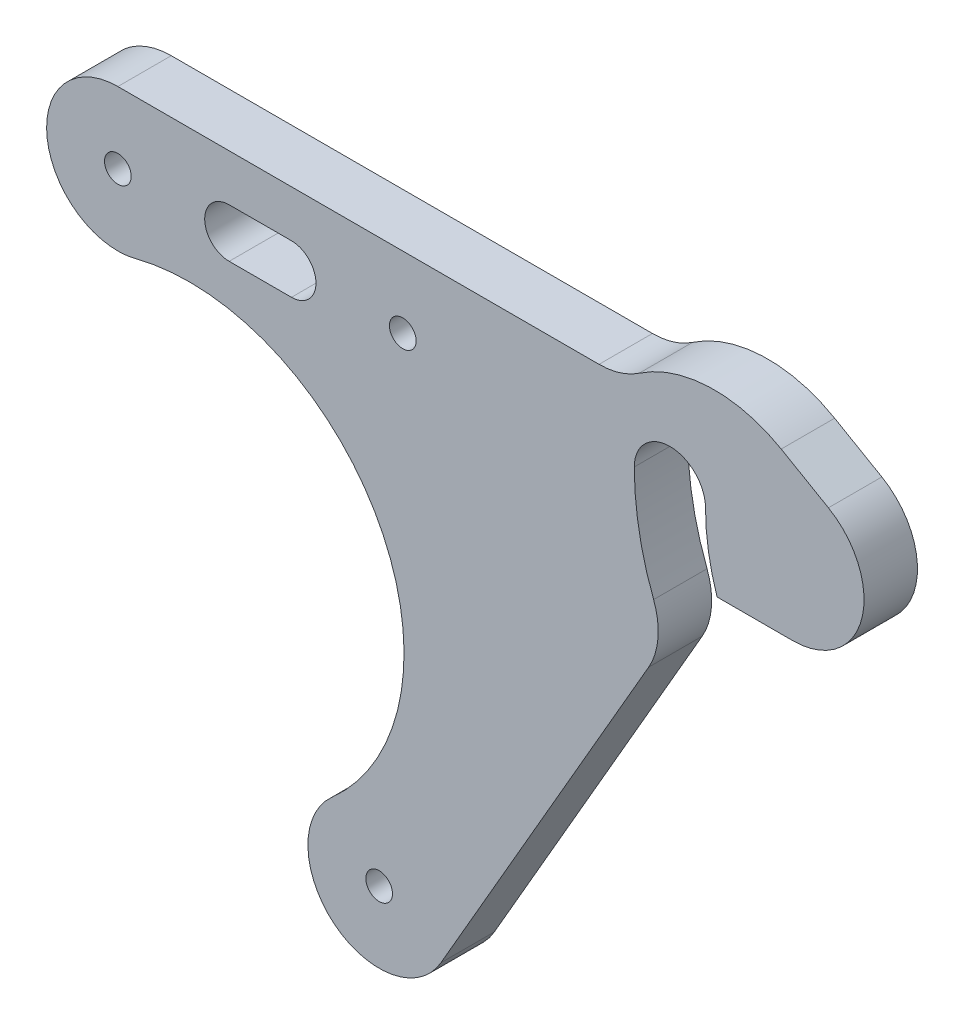
ISO-10303-21;
HEADER;
FILE_DESCRIPTION(('STEP AP214'),'2;1');
FILE_NAME('part.step','',(''),(''),'','','');
FILE_SCHEMA(('AUTOMOTIVE_DESIGN { 1 0 10303 214 1 1 1 1 }'));
ENDSEC;
DATA;
#1=APPLICATION_CONTEXT('core data for automotive mechanical design processes');
#2=APPLICATION_PROTOCOL_DEFINITION('international standard','automotive_design',2000,#1);
#3=PRODUCT_CONTEXT('',#1,'mechanical');
#4=PRODUCT('Part','Part','',(#3));
#5=PRODUCT_RELATED_PRODUCT_CATEGORY('part','',(#4));
#6=PRODUCT_DEFINITION_FORMATION('','',#4);
#7=PRODUCT_DEFINITION_CONTEXT('part definition',#1,'design');
#8=PRODUCT_DEFINITION('design','',#6,#7);
#9=PRODUCT_DEFINITION_SHAPE('','',#8);
#10=(LENGTH_UNIT() NAMED_UNIT(*) SI_UNIT(.MILLI.,.METRE.));
#11=(NAMED_UNIT(*) PLANE_ANGLE_UNIT() SI_UNIT($,.RADIAN.));
#12=(NAMED_UNIT(*) SI_UNIT($,.STERADIAN.) SOLID_ANGLE_UNIT());
#13=UNCERTAINTY_MEASURE_WITH_UNIT(LENGTH_MEASURE(1.E-05),#10,'distance_accuracy_value','');
#14=(GEOMETRIC_REPRESENTATION_CONTEXT(3) GLOBAL_UNCERTAINTY_ASSIGNED_CONTEXT((#13)) GLOBAL_UNIT_ASSIGNED_CONTEXT((#10,
#11,#12)) REPRESENTATION_CONTEXT('',''));
#15=CARTESIAN_POINT('',(0.,0.,0.));
#16=DIRECTION('',(0.,0.,1.));
#17=DIRECTION('',(1.,0.,0.));
#18=AXIS2_PLACEMENT_3D('',#15,#16,#17);
#19=CARTESIAN_POINT('',(7.45121519131535,12.9060426214425,6.));
#20=DIRECTION('',(-0.499995370404268,-0.866028076666282,0.));
#21=DIRECTION('',(0.866028076666282,-0.499995370404268,0.));
#22=AXIS2_PLACEMENT_3D('',#19,#20,#21);
#23=PLANE('',#22);
#24=DIRECTION('',(-0.866028076666282,0.499995370404268,0.));
#25=VECTOR('',#24,1.);
#26=CARTESIAN_POINT('',(7.45121519131535,12.9060426214425,0.));
#27=LINE('',#26,#25);
#28=CARTESIAN_POINT('',(17.8052275255482,6.9282246133319,0.));
#29=VERTEX_POINT('',#28);
#30=CARTESIAN_POINT('',(12.5012357528368,9.99044788584587,0.));
#31=VERTEX_POINT('',#30);
#32=EDGE_CURVE('E220',#29,#31,#27,.T.);
#33=ORIENTED_EDGE('',*,*,#32,.T.);
#34=DIRECTION('',(0.,0.,-1.));
#35=VECTOR('',#34,1.);
#36=CARTESIAN_POINT('',(12.5012357528368,9.99044788584587,6.));
#37=LINE('',#36,#35);
#38=CARTESIAN_POINT('',(12.5012357528368,9.99044788584587,6.));
#39=VERTEX_POINT('',#38);
#40=EDGE_CURVE('E11',#39,#31,#37,.T.);
#41=ORIENTED_EDGE('',*,*,#40,.F.);
#42=DIRECTION('',(-0.866028076666282,0.499995370404268,0.));
#43=VECTOR('',#42,1.);
#44=CARTESIAN_POINT('',(7.45121519131535,12.9060426214425,6.));
#45=LINE('',#44,#43);
#46=CARTESIAN_POINT('',(17.8052275255482,6.9282246133319,6.));
#47=VERTEX_POINT('',#46);
#48=EDGE_CURVE('E314',#47,#39,#45,.T.);
#49=ORIENTED_EDGE('',*,*,#48,.F.);
#50=DIRECTION('',(0.,0.,-1.));
#51=VECTOR('',#50,1.);
#52=CARTESIAN_POINT('',(17.8052275255482,6.9282246133319,6.));
#53=LINE('',#52,#51);
#54=EDGE_CURVE('E252',#47,#29,#53,.T.);
#55=ORIENTED_EDGE('',*,*,#54,.T.);
#56=EDGE_LOOP('',(#33,#41,#49,#55));
#57=FACE_BOUND('',#56,.T.);
#58=ADVANCED_FACE('F37',(#57),#23,.F.);
#59=CARTESIAN_POINT('',(5.00130519677297,-2.99997326414827,6.));
#60=DIRECTION('',(0.,0.,-1.));
#61=DIRECTION('',(-1.,0.,0.));
#62=AXIS2_PLACEMENT_3D('',#59,#60,#61);
#63=CYLINDRICAL_SURFACE('',#62,14.9999999999999);
#64=CARTESIAN_POINT('',(5.00130519677297,-2.99997326414827,0.));
#65=DIRECTION('',(0.,0.,1.));
#66=DIRECTION('',(1.,0.,0.));
#67=AXIS2_PLACEMENT_3D('',#64,#65,#66);
#68=CIRCLE('',#67,14.9999999999999);
#69=CARTESIAN_POINT('',(-3.45186040430899,9.39131364725386,0.));
#70=VERTEX_POINT('',#69);
#71=EDGE_CURVE('E223',#31,#70,#68,.T.);
#72=ORIENTED_EDGE('',*,*,#71,.T.);
#73=DIRECTION('',(0.,0.,-1.));
#74=VECTOR('',#73,1.);
#75=CARTESIAN_POINT('',(-3.45186040430899,9.39131364725386,6.));
#76=LINE('',#75,#74);
#77=CARTESIAN_POINT('',(-3.45186040430899,9.39131364725386,6.));
#78=VERTEX_POINT('',#77);
#79=EDGE_CURVE('E47',#78,#70,#76,.T.);
#80=ORIENTED_EDGE('',*,*,#79,.F.);
#81=CARTESIAN_POINT('',(5.00130519677297,-2.99997326414827,6.));
#82=DIRECTION('',(0.,0.,1.));
#83=DIRECTION('',(1.,0.,0.));
#84=AXIS2_PLACEMENT_3D('',#81,#82,#83);
#85=CIRCLE('',#84,14.9999999999999);
#86=EDGE_CURVE('E316',#39,#78,#85,.T.);
#87=ORIENTED_EDGE('',*,*,#86,.F.);
#88=ORIENTED_EDGE('',*,*,#40,.T.);
#89=EDGE_LOOP('',(#72,#80,#87,#88));
#90=FACE_BOUND('',#89,.T.);
#91=ADVANCED_FACE('F359',(#90),#63,.T.);
#92=CARTESIAN_POINT('',(-7.96021539155269,16.0000000000016,6.));
#93=DIRECTION('',(0.,0.,-1.));
#94=DIRECTION('',(-1.,0.,0.));
#95=AXIS2_PLACEMENT_3D('',#92,#93,#94);
#96=CYLINDRICAL_SURFACE('',#95,8.);
#97=CARTESIAN_POINT('',(-7.96021539155269,16.0000000000016,0.));
#98=DIRECTION('',(0.,0.,1.));
#99=DIRECTION('',(1.,0.,0.));
#100=AXIS2_PLACEMENT_3D('',#97,#98,#99);
#101=CIRCLE('',#100,8.);
#102=CARTESIAN_POINT('',(-7.96021539155269,8.00000000000164,0.));
#103=VERTEX_POINT('',#102);
#104=EDGE_CURVE('E225',#70,#103,#101,.F.);
#105=ORIENTED_EDGE('',*,*,#104,.T.);
#106=DIRECTION('',(0.,0.,-1.));
#107=VECTOR('',#106,1.);
#108=CARTESIAN_POINT('',(-7.96021539155269,8.00000000000164,6.));
#109=LINE('',#108,#107);
#110=CARTESIAN_POINT('',(-7.96021539155269,8.00000000000164,6.));
#111=VERTEX_POINT('',#110);
#112=EDGE_CURVE('E272',#111,#103,#109,.T.);
#113=ORIENTED_EDGE('',*,*,#112,.F.);
#114=CARTESIAN_POINT('',(-7.96021539155269,16.0000000000016,6.));
#115=DIRECTION('',(0.,0.,1.));
#116=DIRECTION('',(1.,0.,0.));
#117=AXIS2_PLACEMENT_3D('',#114,#115,#116);
#118=CIRCLE('',#117,8.);
#119=EDGE_CURVE('E318',#78,#111,#118,.F.);
#120=ORIENTED_EDGE('',*,*,#119,.F.);
#121=ORIENTED_EDGE('',*,*,#79,.T.);
#122=EDGE_LOOP('',(#105,#113,#120,#121));
#123=FACE_BOUND('',#122,.T.);
#124=ADVANCED_FACE('F364',(#123),#96,.F.);
#125=CARTESIAN_POINT('',(0.,8.00000000000164,6.));
#126=DIRECTION('',(0.,-1.,0.));
#127=DIRECTION('',(1.,0.,0.));
#128=AXIS2_PLACEMENT_3D('',#125,#126,#127);
#129=PLANE('',#128);
#130=DIRECTION('',(-1.,0.,0.));
#131=VECTOR('',#130,1.);
#132=CARTESIAN_POINT('',(0.,8.00000000000164,0.));
#133=LINE('',#132,#131);
#134=CARTESIAN_POINT('',(-62.,8.00000000000164,0.));
#135=VERTEX_POINT('',#134);
#136=EDGE_CURVE('E227',#103,#135,#133,.T.);
#137=ORIENTED_EDGE('',*,*,#136,.T.);
#138=DIRECTION('',(0.,0.,-1.));
#139=VECTOR('',#138,1.);
#140=CARTESIAN_POINT('',(-62.,8.00000000000164,6.));
#141=LINE('',#140,#139);
#142=CARTESIAN_POINT('',(-62.,8.00000000000164,6.));
#143=VERTEX_POINT('',#142);
#144=EDGE_CURVE('E269',#143,#135,#141,.T.);
#145=ORIENTED_EDGE('',*,*,#144,.F.);
#146=DIRECTION('',(-1.,0.,0.));
#147=VECTOR('',#146,1.);
#148=CARTESIAN_POINT('',(0.,8.00000000000164,6.));
#149=LINE('',#148,#147);
#150=EDGE_CURVE('E320',#111,#143,#149,.T.);
#151=ORIENTED_EDGE('',*,*,#150,.F.);
#152=ORIENTED_EDGE('',*,*,#112,.T.);
#153=EDGE_LOOP('',(#137,#145,#151,#152));
#154=FACE_BOUND('',#153,.T.);
#155=ADVANCED_FACE('F418',(#154),#129,.F.);
#156=CARTESIAN_POINT('',(-62.,1.62964755900087E-12,6.));
#157=DIRECTION('',(0.,0.,-1.));
#158=DIRECTION('',(-1.,0.,0.));
#159=AXIS2_PLACEMENT_3D('',#156,#157,#158);
#160=CYLINDRICAL_SURFACE('',#159,8.00000000000001);
#161=CARTESIAN_POINT('',(-62.,1.62964755900087E-12,0.));
#162=DIRECTION('',(0.,0.,1.));
#163=DIRECTION('',(1.,0.,0.));
#164=AXIS2_PLACEMENT_3D('',#161,#162,#163);
#165=CIRCLE('',#164,8.00000000000001);
#166=CARTESIAN_POINT('',(-59.997026703284,-7.74519838174709,0.));
#167=VERTEX_POINT('',#166);
#168=EDGE_CURVE('E229',#135,#167,#165,.T.);
#169=ORIENTED_EDGE('',*,*,#168,.T.);
#170=DIRECTION('',(0.,0.,-1.));
#171=VECTOR('',#170,1.);
#172=CARTESIAN_POINT('',(-59.997026703284,-7.74519838174709,6.));
#173=LINE('',#172,#171);
#174=CARTESIAN_POINT('',(-59.997026703284,-7.74519838174709,6.));
#175=VERTEX_POINT('',#174);
#176=EDGE_CURVE('E267',#175,#167,#173,.T.);
#177=ORIENTED_EDGE('',*,*,#176,.F.);
#178=CARTESIAN_POINT('',(-62.,1.62964755900087E-12,6.));
#179=DIRECTION('',(0.,0.,1.));
#180=DIRECTION('',(1.,0.,0.));
#181=AXIS2_PLACEMENT_3D('',#178,#179,#180);
#182=CIRCLE('',#181,8.00000000000001);
#183=EDGE_CURVE('E322',#143,#175,#182,.T.);
#184=ORIENTED_EDGE('',*,*,#183,.F.);
#185=ORIENTED_EDGE('',*,*,#144,.T.);
#186=EDGE_LOOP('',(#169,#177,#184,#185));
#187=FACE_BOUND('',#186,.T.);
#188=ADVANCED_FACE('F414',(#187),#160,.T.);
#189=CARTESIAN_POINT('',(-53.9618845314189,-31.0821911713126,6.));
#190=DIRECTION('',(0.,0.,-1.));
#191=DIRECTION('',(-1.,0.,0.));
#192=AXIS2_PLACEMENT_3D('',#189,#190,#191);
#193=CYLINDRICAL_SURFACE('',#192,24.1047334250943);
#194=CARTESIAN_POINT('',(-53.9618845314189,-31.0821911713126,0.));
#195=DIRECTION('',(0.,0.,1.));
#196=DIRECTION('',(1.,0.,0.));
#197=AXIS2_PLACEMENT_3D('',#194,#195,#196);
#198=CIRCLE('',#197,24.1047334250943);
#199=CARTESIAN_POINT('',(-38.0114462118029,-49.1548691938683,0.));
#200=VERTEX_POINT('',#199);
#201=EDGE_CURVE('E232',#200,#167,#198,.T.);
#202=ORIENTED_EDGE('',*,*,#201,.F.);
#203=DIRECTION('',(0.,0.,-1.));
#204=VECTOR('',#203,1.);
#205=CARTESIAN_POINT('',(-38.0114462118029,-49.1548691938683,6.));
#206=LINE('',#205,#204);
#207=CARTESIAN_POINT('',(-38.0114462118029,-49.1548691938683,6.));
#208=VERTEX_POINT('',#207);
#209=EDGE_CURVE('E265',#208,#200,#206,.T.);
#210=ORIENTED_EDGE('',*,*,#209,.F.);
#211=CARTESIAN_POINT('',(-53.9618845314189,-31.0821911713126,6.));
#212=DIRECTION('',(0.,0.,1.));
#213=DIRECTION('',(1.,0.,0.));
#214=AXIS2_PLACEMENT_3D('',#211,#212,#213);
#215=CIRCLE('',#214,24.1047334250943);
#216=EDGE_CURVE('E324',#208,#175,#215,.T.);
#217=ORIENTED_EDGE('',*,*,#216,.T.);
#218=ORIENTED_EDGE('',*,*,#176,.T.);
#219=EDGE_LOOP('',(#202,#210,#217,#218));
#220=FACE_BOUND('',#219,.T.);
#221=ADVANCED_FACE('F410',(#220),#193,.F.);
#222=CARTESIAN_POINT('',(-32.6527251776309,-55.0949120285555,6.));
#223=DIRECTION('',(0.,0.,-1.));
#224=DIRECTION('',(-1.,0.,0.));
#225=AXIS2_PLACEMENT_3D('',#222,#223,#224);
#226=CYLINDRICAL_SURFACE('',#225,7.9999999999998);
#227=CARTESIAN_POINT('',(-32.6527251776309,-55.0949120285555,0.));
#228=DIRECTION('',(0.,0.,1.));
#229=DIRECTION('',(1.,0.,0.));
#230=AXIS2_PLACEMENT_3D('',#227,#228,#229);
#231=CIRCLE('',#230,7.9999999999998);
#232=CARTESIAN_POINT('',(-25.7245219473544,-59.0949120285561,0.));
#233=VERTEX_POINT('',#232);
#234=EDGE_CURVE('E235',#233,#200,#231,.F.);
#235=ORIENTED_EDGE('',*,*,#234,.F.);
#236=DIRECTION('',(0.,0.,-1.));
#237=VECTOR('',#236,1.);
#238=CARTESIAN_POINT('',(-25.7245219473544,-59.0949120285561,6.));
#239=LINE('',#238,#237);
#240=CARTESIAN_POINT('',(-25.7245219473544,-59.0949120285561,6.));
#241=VERTEX_POINT('',#240);
#242=EDGE_CURVE('E263',#241,#233,#239,.T.);
#243=ORIENTED_EDGE('',*,*,#242,.F.);
#244=CARTESIAN_POINT('',(-32.6527251776309,-55.0949120285555,6.));
#245=DIRECTION('',(0.,0.,1.));
#246=DIRECTION('',(1.,0.,0.));
#247=AXIS2_PLACEMENT_3D('',#244,#245,#246);
#248=CIRCLE('',#247,7.9999999999998);
#249=EDGE_CURVE('E327',#241,#208,#248,.F.);
#250=ORIENTED_EDGE('',*,*,#249,.T.);
#251=ORIENTED_EDGE('',*,*,#209,.T.);
#252=EDGE_LOOP('',(#235,#243,#250,#251));
#253=FACE_BOUND('',#252,.T.);
#254=ADVANCED_FACE('F406',(#253),#226,.T.);
#255=CARTESIAN_POINT('',(6.29545606505251,-3.63468325382956,6.));
#256=DIRECTION('',(-0.866025403784436,0.500000000000004,0.));
#257=DIRECTION('',(-0.500000000000004,-0.866025403784436,0.));
#258=AXIS2_PLACEMENT_3D('',#255,#256,#257);
#259=PLANE('',#258);
#260=DIRECTION('',(0.500000000000004,0.866025403784436,0.));
#261=VECTOR('',#260,1.);
#262=CARTESIAN_POINT('',(6.29545606505251,-3.63468325382956,0.));
#263=LINE('',#262,#261);
#264=CARTESIAN_POINT('',(-2.37907845150454,-18.6594177685161,0.));
#265=VERTEX_POINT('',#264);
#266=EDGE_CURVE('E238',#233,#265,#263,.T.);
#267=ORIENTED_EDGE('',*,*,#266,.T.);
#268=DIRECTION('',(0.,0.,-1.));
#269=VECTOR('',#268,1.);
#270=CARTESIAN_POINT('',(-2.37907845150454,-18.6594177685161,6.));
#271=LINE('',#270,#269);
#272=CARTESIAN_POINT('',(-2.37907845150454,-18.6594177685161,6.));
#273=VERTEX_POINT('',#272);
#274=EDGE_CURVE('E260',#273,#265,#271,.T.);
#275=ORIENTED_EDGE('',*,*,#274,.F.);
#276=DIRECTION('',(0.500000000000004,0.866025403784436,0.));
#277=VECTOR('',#276,1.);
#278=CARTESIAN_POINT('',(6.29545606505251,-3.63468325382956,6.));
#279=LINE('',#278,#277);
#280=EDGE_CURVE('E330',#241,#273,#279,.T.);
#281=ORIENTED_EDGE('',*,*,#280,.F.);
#282=ORIENTED_EDGE('',*,*,#242,.T.);
#283=EDGE_LOOP('',(#267,#275,#281,#282));
#284=FACE_BOUND('',#283,.T.);
#285=ADVANCED_FACE('F402',(#284),#259,.F.);
#286=CARTESIAN_POINT('',(-9.30728168178016,-14.6594177685167,6.));
#287=DIRECTION('',(0.,0.,-1.));
#288=DIRECTION('',(-1.,0.,0.));
#289=AXIS2_PLACEMENT_3D('',#286,#287,#288);
#290=CYLINDRICAL_SURFACE('',#289,8.00000000000017);
#291=CARTESIAN_POINT('',(-9.30728168178016,-14.6594177685167,0.));
#292=DIRECTION('',(0.,0.,1.));
#293=DIRECTION('',(1.,0.,0.));
#294=AXIS2_PLACEMENT_3D('',#291,#292,#293);
#295=CIRCLE('',#294,8.00000000000017);
#296=CARTESIAN_POINT('',(-1.82950584046509,-11.8163791709853,0.));
#297=VERTEX_POINT('',#296);
#298=EDGE_CURVE('E240',#265,#297,#295,.T.);
#299=ORIENTED_EDGE('',*,*,#298,.T.);
#300=DIRECTION('',(0.,0.,-1.));
#301=VECTOR('',#300,1.);
#302=CARTESIAN_POINT('',(-1.82950584046509,-11.8163791709853,6.));
#303=LINE('',#302,#301);
#304=CARTESIAN_POINT('',(-1.82950584046509,-11.8163791709853,6.));
#305=VERTEX_POINT('',#304);
#306=EDGE_CURVE('E258',#305,#297,#303,.T.);
#307=ORIENTED_EDGE('',*,*,#306,.F.);
#308=CARTESIAN_POINT('',(-9.30728168178016,-14.6594177685167,6.));
#309=DIRECTION('',(0.,0.,1.));
#310=DIRECTION('',(1.,0.,0.));
#311=AXIS2_PLACEMENT_3D('',#308,#309,#310);
#312=CIRCLE('',#311,8.00000000000017);
#313=EDGE_CURVE('E332',#273,#305,#312,.T.);
#314=ORIENTED_EDGE('',*,*,#313,.F.);
#315=ORIENTED_EDGE('',*,*,#274,.T.);
#316=EDGE_LOOP('',(#299,#307,#314,#315));
#317=FACE_BOUND('',#316,.T.);
#318=ADVANCED_FACE('F398',(#317),#290,.T.);
#319=CARTESIAN_POINT('',(29.25,0.,6.));
#320=DIRECTION('',(0.,0.,-1.));
#321=DIRECTION('',(-1.,0.,0.));
#322=AXIS2_PLACEMENT_3D('',#319,#320,#321);
#323=CYLINDRICAL_SURFACE('',#322,33.25);
#324=CARTESIAN_POINT('',(29.25,0.,0.));
#325=DIRECTION('',(0.,0.,1.));
#326=DIRECTION('',(1.,0.,0.));
#327=AXIS2_PLACEMENT_3D('',#324,#325,#326);
#328=CIRCLE('',#327,33.25);
#329=CARTESIAN_POINT('',(-4.,0.,0.));
#330=VERTEX_POINT('',#329);
#331=EDGE_CURVE('E243',#330,#297,#328,.T.);
#332=ORIENTED_EDGE('',*,*,#331,.F.);
#333=DIRECTION('',(0.,0.,-1.));
#334=VECTOR('',#333,1.);
#335=CARTESIAN_POINT('',(-4.,0.,6.));
#336=LINE('',#335,#334);
#337=CARTESIAN_POINT('',(-4.,0.,6.));
#338=VERTEX_POINT('',#337);
#339=EDGE_CURVE('E256',#338,#330,#336,.T.);
#340=ORIENTED_EDGE('',*,*,#339,.F.);
#341=CARTESIAN_POINT('',(29.25,0.,6.));
#342=DIRECTION('',(0.,0.,1.));
#343=DIRECTION('',(1.,0.,0.));
#344=AXIS2_PLACEMENT_3D('',#341,#342,#343);
#345=CIRCLE('',#344,33.25);
#346=EDGE_CURVE('E334',#338,#305,#345,.T.);
#347=ORIENTED_EDGE('',*,*,#346,.T.);
#348=ORIENTED_EDGE('',*,*,#306,.T.);
#349=EDGE_LOOP('',(#332,#340,#347,#348));
#350=FACE_BOUND('',#349,.T.);
#351=ADVANCED_FACE('F395',(#350),#323,.F.);
#352=CARTESIAN_POINT('',(0.,0.,6.));
#353=DIRECTION('',(0.,0.,-1.));
#354=DIRECTION('',(-1.,0.,0.));
#355=AXIS2_PLACEMENT_3D('',#352,#353,#354);
#356=CYLINDRICAL_SURFACE('',#355,4.);
#357=CARTESIAN_POINT('',(0.,0.,0.));
#358=DIRECTION('',(0.,0.,1.));
#359=DIRECTION('',(1.,0.,0.));
#360=AXIS2_PLACEMENT_3D('',#357,#358,#359);
#361=CIRCLE('',#360,4.);
#362=CARTESIAN_POINT('',(4.,0.,0.));
#363=VERTEX_POINT('',#362);
#364=EDGE_CURVE('E246',#363,#330,#361,.T.);
#365=ORIENTED_EDGE('',*,*,#364,.F.);
#366=DIRECTION('',(0.,0.,-1.));
#367=VECTOR('',#366,1.);
#368=CARTESIAN_POINT('',(4.,0.,6.));
#369=LINE('',#368,#367);
#370=CARTESIAN_POINT('',(4.,0.,6.));
#371=VERTEX_POINT('',#370);
#372=EDGE_CURVE('E190',#371,#363,#369,.T.);
#373=ORIENTED_EDGE('',*,*,#372,.F.);
#374=CARTESIAN_POINT('',(0.,0.,6.));
#375=DIRECTION('',(0.,0.,1.));
#376=DIRECTION('',(1.,0.,0.));
#377=AXIS2_PLACEMENT_3D('',#374,#375,#376);
#378=CIRCLE('',#377,4.);
#379=EDGE_CURVE('E183',#371,#338,#378,.T.);
#380=ORIENTED_EDGE('',*,*,#379,.T.);
#381=ORIENTED_EDGE('',*,*,#339,.T.);
#382=EDGE_LOOP('',(#365,#373,#380,#381));
#383=FACE_BOUND('',#382,.T.);
#384=ADVANCED_FACE('F338',(#383),#356,.F.);
#385=CARTESIAN_POINT('',(29.25,0.,6.));
#386=DIRECTION('',(0.,0.,-1.));
#387=DIRECTION('',(-1.,0.,0.));
#388=AXIS2_PLACEMENT_3D('',#385,#386,#387);
#389=CYLINDRICAL_SURFACE('',#388,25.25);
#390=CARTESIAN_POINT('',(29.25,0.,0.));
#391=DIRECTION('',(0.,0.,1.));
#392=DIRECTION('',(1.,0.,0.));
#393=AXIS2_PLACEMENT_3D('',#390,#391,#392);
#394=CIRCLE('',#393,25.25);
#395=CARTESIAN_POINT('',(5.30083508762724,-7.99999999999833,0.));
#396=VERTEX_POINT('',#395);
#397=EDGE_CURVE('E189',#363,#396,#394,.T.);
#398=ORIENTED_EDGE('',*,*,#397,.T.);
#399=DIRECTION('',(0.,0.,-1.));
#400=VECTOR('',#399,1.);
#401=CARTESIAN_POINT('',(5.30083508762724,-7.99999999999833,6.));
#402=LINE('',#401,#400);
#403=CARTESIAN_POINT('',(5.30083508762724,-7.99999999999833,6.));
#404=VERTEX_POINT('',#403);
#405=EDGE_CURVE('E186',#404,#396,#402,.T.);
#406=ORIENTED_EDGE('',*,*,#405,.F.);
#407=CARTESIAN_POINT('',(29.25,0.,6.));
#408=DIRECTION('',(0.,0.,1.));
#409=DIRECTION('',(1.,0.,0.));
#410=AXIS2_PLACEMENT_3D('',#407,#408,#409);
#411=CIRCLE('',#410,25.25);
#412=EDGE_CURVE('E176',#371,#404,#411,.T.);
#413=ORIENTED_EDGE('',*,*,#412,.F.);
#414=ORIENTED_EDGE('',*,*,#372,.T.);
#415=EDGE_LOOP('',(#398,#406,#413,#414));
#416=FACE_BOUND('',#415,.T.);
#417=ADVANCED_FACE('F187',(#416),#389,.T.);
#418=CARTESIAN_POINT('',(0.,-7.99999999999833,6.));
#419=DIRECTION('',(0.,1.,0.));
#420=DIRECTION('',(-1.,0.,0.));
#421=AXIS2_PLACEMENT_3D('',#418,#419,#420);
#422=PLANE('',#421);
#423=DIRECTION('',(1.,0.,0.));
#424=VECTOR('',#423,1.);
#425=CARTESIAN_POINT('',(0.,-7.99999999999833,0.));
#426=LINE('',#425,#424);
#427=CARTESIAN_POINT('',(13.805264562314,-7.99999999999834,0.));
#428=VERTEX_POINT('',#427);
#429=EDGE_CURVE('E115',#396,#428,#426,.T.);
#430=ORIENTED_EDGE('',*,*,#429,.T.);
#431=DIRECTION('',(0.,0.,-1.));
#432=VECTOR('',#431,1.);
#433=CARTESIAN_POINT('',(13.805264562314,-7.99999999999834,6.));
#434=LINE('',#433,#432);
#435=CARTESIAN_POINT('',(13.805264562314,-7.99999999999834,6.));
#436=VERTEX_POINT('',#435);
#437=EDGE_CURVE('E191',#436,#428,#434,.T.);
#438=ORIENTED_EDGE('',*,*,#437,.F.);
#439=DIRECTION('',(1.,0.,0.));
#440=VECTOR('',#439,1.);
#441=CARTESIAN_POINT('',(0.,-7.99999999999833,6.));
#442=LINE('',#441,#440);
#443=EDGE_CURVE('E180',#404,#436,#442,.T.);
#444=ORIENTED_EDGE('',*,*,#443,.F.);
#445=ORIENTED_EDGE('',*,*,#405,.T.);
#446=EDGE_LOOP('',(#430,#438,#444,#445));
#447=FACE_BOUND('',#446,.T.);
#448=ADVANCED_FACE('F193',(#447),#422,.F.);
#449=CARTESIAN_POINT('',(0.,-2.74999999999838,6.));
#450=DIRECTION('',(0.,-1.,0.));
#451=DIRECTION('',(0.,0.,-1.));
#452=AXIS2_PLACEMENT_3D('',#449,#450,#451);
#453=PLANE('',#452);
#454=DIRECTION('',(-1.,0.,0.));
#455=VECTOR('',#454,1.);
#456=CARTESIAN_POINT('',(0.,-2.74999999999838,0.));
#457=LINE('',#456,#455);
#458=CARTESIAN_POINT('',(-42.5,-2.74999999999838,0.));
#459=VERTEX_POINT('',#458);
#460=CARTESIAN_POINT('',(-49.5,-2.74999999999838,0.));
#461=VERTEX_POINT('',#460);
#462=EDGE_CURVE('E199',#459,#461,#457,.T.);
#463=ORIENTED_EDGE('',*,*,#462,.T.);
#464=DIRECTION('',(0.,0.,-1.));
#465=VECTOR('',#464,1.);
#466=CARTESIAN_POINT('',(-49.5,-2.74999999999838,6.));
#467=LINE('',#466,#465);
#468=CARTESIAN_POINT('',(-49.5,-2.74999999999838,6.));
#469=VERTEX_POINT('',#468);
#470=EDGE_CURVE('E41',#469,#461,#467,.T.);
#471=ORIENTED_EDGE('',*,*,#470,.F.);
#472=DIRECTION('',(-1.,0.,0.));
#473=VECTOR('',#472,1.);
#474=CARTESIAN_POINT('',(0.,-2.74999999999838,6.));
#475=LINE('',#474,#473);
#476=CARTESIAN_POINT('',(-42.5,-2.74999999999838,6.));
#477=VERTEX_POINT('',#476);
#478=EDGE_CURVE('E130',#477,#469,#475,.T.);
#479=ORIENTED_EDGE('',*,*,#478,.F.);
#480=DIRECTION('',(0.,0.,-1.));
#481=VECTOR('',#480,1.);
#482=CARTESIAN_POINT('',(-42.5,-2.74999999999838,6.));
#483=LINE('',#482,#481);
#484=EDGE_CURVE('E195',#477,#459,#483,.T.);
#485=ORIENTED_EDGE('',*,*,#484,.T.);
#486=EDGE_LOOP('',(#463,#471,#479,#485));
#487=FACE_BOUND('',#486,.T.);
#488=ADVANCED_FACE('F39',(#487),#453,.F.);
#489=CARTESIAN_POINT('',(-49.5,1.6228338117763E-12,6.));
#490=DIRECTION('',(0.,0.,-1.));
#491=DIRECTION('',(-1.,0.,0.));
#492=AXIS2_PLACEMENT_3D('',#489,#490,#491);
#493=CYLINDRICAL_SURFACE('',#492,2.75);
#494=CARTESIAN_POINT('',(-49.5,1.6228338117763E-12,0.));
#495=DIRECTION('',(0.,0.,1.));
#496=DIRECTION('',(1.,0.,0.));
#497=AXIS2_PLACEMENT_3D('',#494,#495,#496);
#498=CIRCLE('',#497,2.75);
#499=CARTESIAN_POINT('',(-49.5,2.75000000000162,0.));
#500=VERTEX_POINT('',#499);
#501=EDGE_CURVE('E202',#500,#461,#498,.T.);
#502=ORIENTED_EDGE('',*,*,#501,.F.);
#503=DIRECTION('',(0.,0.,-1.));
#504=VECTOR('',#503,1.);
#505=CARTESIAN_POINT('',(-49.5,2.75000000000162,6.));
#506=LINE('',#505,#504);
#507=CARTESIAN_POINT('',(-49.5,2.75000000000162,6.));
#508=VERTEX_POINT('',#507);
#509=EDGE_CURVE('E279',#508,#500,#506,.T.);
#510=ORIENTED_EDGE('',*,*,#509,.F.);
#511=CARTESIAN_POINT('',(-49.5,1.6228338117763E-12,6.));
#512=DIRECTION('',(0.,0.,1.));
#513=DIRECTION('',(1.,0.,0.));
#514=AXIS2_PLACEMENT_3D('',#511,#512,#513);
#515=CIRCLE('',#514,2.75);
#516=EDGE_CURVE('E287',#508,#469,#515,.T.);
#517=ORIENTED_EDGE('',*,*,#516,.T.);
#518=ORIENTED_EDGE('',*,*,#470,.T.);
#519=EDGE_LOOP('',(#502,#510,#517,#518));
#520=FACE_BOUND('',#519,.T.);
#521=ADVANCED_FACE('F286',(#520),#493,.F.);
#522=CARTESIAN_POINT('',(0.,2.75000000000162,6.));
#523=DIRECTION('',(0.,1.,0.));
#524=DIRECTION('',(0.,0.,1.));
#525=AXIS2_PLACEMENT_3D('',#522,#523,#524);
#526=PLANE('',#525);
#527=DIRECTION('',(1.,0.,0.));
#528=VECTOR('',#527,1.);
#529=CARTESIAN_POINT('',(0.,2.75000000000162,0.));
#530=LINE('',#529,#528);
#531=CARTESIAN_POINT('',(-42.5,2.75000000000162,0.));
#532=VERTEX_POINT('',#531);
#533=EDGE_CURVE('E205',#500,#532,#530,.T.);
#534=ORIENTED_EDGE('',*,*,#533,.T.);
#535=DIRECTION('',(0.,0.,-1.));
#536=VECTOR('',#535,1.);
#537=CARTESIAN_POINT('',(-42.5,2.75000000000162,6.));
#538=LINE('',#537,#536);
#539=CARTESIAN_POINT('',(-42.5,2.75000000000162,6.));
#540=VERTEX_POINT('',#539);
#541=EDGE_CURVE('E278',#540,#532,#538,.T.);
#542=ORIENTED_EDGE('',*,*,#541,.F.);
#543=DIRECTION('',(1.,0.,0.));
#544=VECTOR('',#543,1.);
#545=CARTESIAN_POINT('',(0.,2.75000000000162,6.));
#546=LINE('',#545,#544);
#547=EDGE_CURVE('E297',#508,#540,#546,.T.);
#548=ORIENTED_EDGE('',*,*,#547,.F.);
#549=ORIENTED_EDGE('',*,*,#509,.T.);
#550=EDGE_LOOP('',(#534,#542,#548,#549));
#551=FACE_BOUND('',#550,.T.);
#552=ADVANCED_FACE('F295',(#551),#526,.F.);
#553=CARTESIAN_POINT('',(-62.,1.62964755900087E-12,6.));
#554=DIRECTION('',(0.,0.,-1.));
#555=DIRECTION('',(-1.,0.,0.));
#556=AXIS2_PLACEMENT_3D('',#553,#554,#555);
#557=CYLINDRICAL_SURFACE('',#556,1.5);
#558=CARTESIAN_POINT('',(-62.,1.62964755900087E-12,6.));
#559=DIRECTION('',(0.,0.,1.));
#560=DIRECTION('',(1.,0.,0.));
#561=AXIS2_PLACEMENT_3D('',#558,#559,#560);
#562=CIRCLE('',#561,1.5);
#563=CARTESIAN_POINT('',(-60.5,1.62964755900087E-12,6.));
#564=VERTEX_POINT('',#563);
#565=EDGE_CURVE('E311',#564,#564,#562,.T.);
#566=ORIENTED_EDGE('',*,*,#565,.T.);
#567=EDGE_LOOP('',(#566));
#568=FACE_BOUND('',#567,.T.);
#569=CARTESIAN_POINT('',(-62.,1.62964755900087E-12,0.));
#570=DIRECTION('',(0.,0.,1.));
#571=DIRECTION('',(1.,0.,0.));
#572=AXIS2_PLACEMENT_3D('',#569,#570,#571);
#573=CIRCLE('',#572,1.5);
#574=CARTESIAN_POINT('',(-60.5,1.62964755900087E-12,0.));
#575=VERTEX_POINT('',#574);
#576=EDGE_CURVE('E217',#575,#575,#573,.T.);
#577=ORIENTED_EDGE('',*,*,#576,.F.);
#578=EDGE_LOOP('',(#577));
#579=FACE_BOUND('',#578,.T.);
#580=ADVANCED_FACE('F369',(#568,#579),#557,.F.);
#581=CARTESIAN_POINT('',(-32.6527251776309,-55.0949120285555,6.));
#582=DIRECTION('',(0.,0.,-1.));
#583=DIRECTION('',(-1.,0.,0.));
#584=AXIS2_PLACEMENT_3D('',#581,#582,#583);
#585=CYLINDRICAL_SURFACE('',#584,1.50000000000073);
#586=CARTESIAN_POINT('',(-32.6527251776309,-55.0949120285555,6.));
#587=DIRECTION('',(0.,0.,1.));
#588=DIRECTION('',(1.,0.,0.));
#589=AXIS2_PLACEMENT_3D('',#586,#587,#588);
#590=CIRCLE('',#589,1.50000000000073);
#591=CARTESIAN_POINT('',(-31.1527251776301,-55.0949120285555,6.));
#592=VERTEX_POINT('',#591);
#593=EDGE_CURVE('E304',#592,#592,#590,.T.);
#594=ORIENTED_EDGE('',*,*,#593,.T.);
#595=EDGE_LOOP('',(#594));
#596=FACE_BOUND('',#595,.T.);
#597=CARTESIAN_POINT('',(-32.6527251776309,-55.0949120285555,0.));
#598=DIRECTION('',(0.,0.,1.));
#599=DIRECTION('',(1.,0.,0.));
#600=AXIS2_PLACEMENT_3D('',#597,#598,#599);
#601=CIRCLE('',#600,1.50000000000073);
#602=CARTESIAN_POINT('',(-31.1527251776301,-55.0949120285555,0.));
#603=VERTEX_POINT('',#602);
#604=EDGE_CURVE('E214',#603,#603,#601,.T.);
#605=ORIENTED_EDGE('',*,*,#604,.F.);
#606=EDGE_LOOP('',(#605));
#607=FACE_BOUND('',#606,.T.);
#608=ADVANCED_FACE('F372',(#596,#607),#585,.F.);
#609=CARTESIAN_POINT('',(-30.,1.6228338117763E-12,6.));
#610=DIRECTION('',(0.,0.,-1.));
#611=DIRECTION('',(-1.,0.,0.));
#612=AXIS2_PLACEMENT_3D('',#609,#610,#611);
#613=CYLINDRICAL_SURFACE('',#612,1.5);
#614=CARTESIAN_POINT('',(-30.,1.6228338117763E-12,6.));
#615=DIRECTION('',(0.,0.,1.));
#616=DIRECTION('',(1.,0.,0.));
#617=AXIS2_PLACEMENT_3D('',#614,#615,#616);
#618=CIRCLE('',#617,1.5);
#619=CARTESIAN_POINT('',(-28.5,1.6228338117763E-12,6.));
#620=VERTEX_POINT('',#619);
#621=EDGE_CURVE('E301',#620,#620,#618,.T.);
#622=ORIENTED_EDGE('',*,*,#621,.T.);
#623=EDGE_LOOP('',(#622));
#624=FACE_BOUND('',#623,.T.);
#625=CARTESIAN_POINT('',(-30.,1.6228338117763E-12,0.));
#626=DIRECTION('',(0.,0.,1.));
#627=DIRECTION('',(1.,0.,0.));
#628=AXIS2_PLACEMENT_3D('',#625,#626,#627);
#629=CIRCLE('',#628,1.5);
#630=CARTESIAN_POINT('',(-28.5,1.6228338117763E-12,0.));
#631=VERTEX_POINT('',#630);
#632=EDGE_CURVE('E211',#631,#631,#629,.T.);
#633=ORIENTED_EDGE('',*,*,#632,.F.);
#634=EDGE_LOOP('',(#633));
#635=FACE_BOUND('',#634,.T.);
#636=ADVANCED_FACE('F354',(#624,#635),#613,.F.);
#637=CARTESIAN_POINT('',(-42.5,1.6228338117763E-12,6.));
#638=DIRECTION('',(0.,0.,-1.));
#639=DIRECTION('',(-1.,0.,0.));
#640=AXIS2_PLACEMENT_3D('',#637,#638,#639);
#641=CYLINDRICAL_SURFACE('',#640,2.75);
#642=CARTESIAN_POINT('',(-42.5,1.6228338117763E-12,0.));
#643=DIRECTION('',(0.,0.,1.));
#644=DIRECTION('',(1.,0.,0.));
#645=AXIS2_PLACEMENT_3D('',#642,#643,#644);
#646=CIRCLE('',#645,2.75);
#647=EDGE_CURVE('E208',#459,#532,#646,.T.);
#648=ORIENTED_EDGE('',*,*,#647,.F.);
#649=ORIENTED_EDGE('',*,*,#484,.F.);
#650=CARTESIAN_POINT('',(-42.5,1.6228338117763E-12,6.));
#651=DIRECTION('',(0.,0.,1.));
#652=DIRECTION('',(1.,0.,0.));
#653=AXIS2_PLACEMENT_3D('',#650,#651,#652);
#654=CIRCLE('',#653,2.75);
#655=EDGE_CURVE('E299',#477,#540,#654,.T.);
#656=ORIENTED_EDGE('',*,*,#655,.T.);
#657=ORIENTED_EDGE('',*,*,#541,.T.);
#658=EDGE_LOOP('',(#648,#649,#656,#657));
#659=FACE_BOUND('',#658,.T.);
#660=ADVANCED_FACE('F300',(#659),#641,.F.);
#661=CARTESIAN_POINT('',(13.805264562314,1.65031437936054E-12,6.));
#662=DIRECTION('',(0.,0.,-1.));
#663=DIRECTION('',(-1.,0.,0.));
#664=AXIS2_PLACEMENT_3D('',#661,#662,#663);
#665=CYLINDRICAL_SURFACE('',#664,8.);
#666=CARTESIAN_POINT('',(13.805264562314,1.65031437936054E-12,0.));
#667=DIRECTION('',(0.,0.,1.));
#668=DIRECTION('',(1.,0.,0.));
#669=AXIS2_PLACEMENT_3D('',#666,#667,#668);
#670=CIRCLE('',#669,8.);
#671=EDGE_CURVE('E121',#428,#29,#670,.T.);
#672=ORIENTED_EDGE('',*,*,#671,.T.);
#673=ORIENTED_EDGE('',*,*,#54,.F.);
#674=CARTESIAN_POINT('',(13.805264562314,1.65031437936054E-12,6.));
#675=DIRECTION('',(0.,0.,1.));
#676=DIRECTION('',(1.,0.,0.));
#677=AXIS2_PLACEMENT_3D('',#674,#675,#676);
#678=CIRCLE('',#677,8.);
#679=EDGE_CURVE('E56',#436,#47,#678,.T.);
#680=ORIENTED_EDGE('',*,*,#679,.F.);
#681=ORIENTED_EDGE('',*,*,#437,.T.);
#682=EDGE_LOOP('',(#672,#673,#680,#681));
#683=FACE_BOUND('',#682,.T.);
#684=ADVANCED_FACE('F346',(#683),#665,.T.);
#685=CARTESIAN_POINT('',(0.,0.,6.));
#686=DIRECTION('',(0.,0.,1.));
#687=DIRECTION('',(1.,0.,0.));
#688=AXIS2_PLACEMENT_3D('',#685,#686,#687);
#689=PLANE('',#688);
#690=ORIENTED_EDGE('',*,*,#478,.T.);
#691=ORIENTED_EDGE('',*,*,#516,.F.);
#692=ORIENTED_EDGE('',*,*,#547,.T.);
#693=ORIENTED_EDGE('',*,*,#655,.F.);
#694=EDGE_LOOP('',(#690,#691,#692,#693));
#695=FACE_BOUND('',#694,.T.);
#696=ORIENTED_EDGE('',*,*,#621,.F.);
#697=EDGE_LOOP('',(#696));
#698=FACE_BOUND('',#697,.T.);
#699=ORIENTED_EDGE('',*,*,#593,.F.);
#700=EDGE_LOOP('',(#699));
#701=FACE_BOUND('',#700,.T.);
#702=ORIENTED_EDGE('',*,*,#565,.F.);
#703=EDGE_LOOP('',(#702));
#704=FACE_BOUND('',#703,.T.);
#705=ORIENTED_EDGE('',*,*,#48,.T.);
#706=ORIENTED_EDGE('',*,*,#86,.T.);
#707=ORIENTED_EDGE('',*,*,#119,.T.);
#708=ORIENTED_EDGE('',*,*,#150,.T.);
#709=ORIENTED_EDGE('',*,*,#183,.T.);
#710=ORIENTED_EDGE('',*,*,#216,.F.);
#711=ORIENTED_EDGE('',*,*,#249,.F.);
#712=ORIENTED_EDGE('',*,*,#280,.T.);
#713=ORIENTED_EDGE('',*,*,#313,.T.);
#714=ORIENTED_EDGE('',*,*,#346,.F.);
#715=ORIENTED_EDGE('',*,*,#379,.F.);
#716=ORIENTED_EDGE('',*,*,#412,.T.);
#717=ORIENTED_EDGE('',*,*,#443,.T.);
#718=ORIENTED_EDGE('',*,*,#679,.T.);
#719=EDGE_LOOP('',(#705,#706,#707,#708,#709,#710,#711,#712,#713,#714,#715,#716,#717,#718));
#720=FACE_BOUND('',#719,.T.);
#721=ADVANCED_FACE('F178',(#695,#698,#701,#704,#720),#689,.T.);
#722=CARTESIAN_POINT('',(0.,0.,0.));
#723=DIRECTION('',(0.,0.,1.));
#724=DIRECTION('',(1.,0.,0.));
#725=AXIS2_PLACEMENT_3D('',#722,#723,#724);
#726=PLANE('',#725);
#727=ORIENTED_EDGE('',*,*,#462,.F.);
#728=ORIENTED_EDGE('',*,*,#647,.T.);
#729=ORIENTED_EDGE('',*,*,#533,.F.);
#730=ORIENTED_EDGE('',*,*,#501,.T.);
#731=EDGE_LOOP('',(#727,#728,#729,#730));
#732=FACE_BOUND('',#731,.T.);
#733=ORIENTED_EDGE('',*,*,#632,.T.);
#734=EDGE_LOOP('',(#733));
#735=FACE_BOUND('',#734,.T.);
#736=ORIENTED_EDGE('',*,*,#604,.T.);
#737=EDGE_LOOP('',(#736));
#738=FACE_BOUND('',#737,.T.);
#739=ORIENTED_EDGE('',*,*,#576,.T.);
#740=EDGE_LOOP('',(#739));
#741=FACE_BOUND('',#740,.T.);
#742=ORIENTED_EDGE('',*,*,#32,.F.);
#743=ORIENTED_EDGE('',*,*,#671,.F.);
#744=ORIENTED_EDGE('',*,*,#429,.F.);
#745=ORIENTED_EDGE('',*,*,#397,.F.);
#746=ORIENTED_EDGE('',*,*,#364,.T.);
#747=ORIENTED_EDGE('',*,*,#331,.T.);
#748=ORIENTED_EDGE('',*,*,#298,.F.);
#749=ORIENTED_EDGE('',*,*,#266,.F.);
#750=ORIENTED_EDGE('',*,*,#234,.T.);
#751=ORIENTED_EDGE('',*,*,#201,.T.);
#752=ORIENTED_EDGE('',*,*,#168,.F.);
#753=ORIENTED_EDGE('',*,*,#136,.F.);
#754=ORIENTED_EDGE('',*,*,#104,.F.);
#755=ORIENTED_EDGE('',*,*,#71,.F.);
#756=EDGE_LOOP('',(#742,#743,#744,#745,#746,#747,#748,#749,#750,#751,#752,#753,#754,#755));
#757=FACE_BOUND('',#756,.T.);
#758=ADVANCED_FACE('F292',(#732,#735,#738,#741,#757),#726,.F.);
#759=CLOSED_SHELL('',(#58,#91,#124,#155,#188,#221,#254,#285,#318,#351,#384,#417,#448,#488,#521,
#552,#580,#608,#636,#660,#684,#721,#758));
#760=MANIFOLD_SOLID_BREP('B2',#759);
#761=ADVANCED_BREP_SHAPE_REPRESENTATION('',(#18,#760),#14);
#762=SHAPE_DEFINITION_REPRESENTATION(#9,#761);
ENDSEC;
END-ISO-10303-21;
